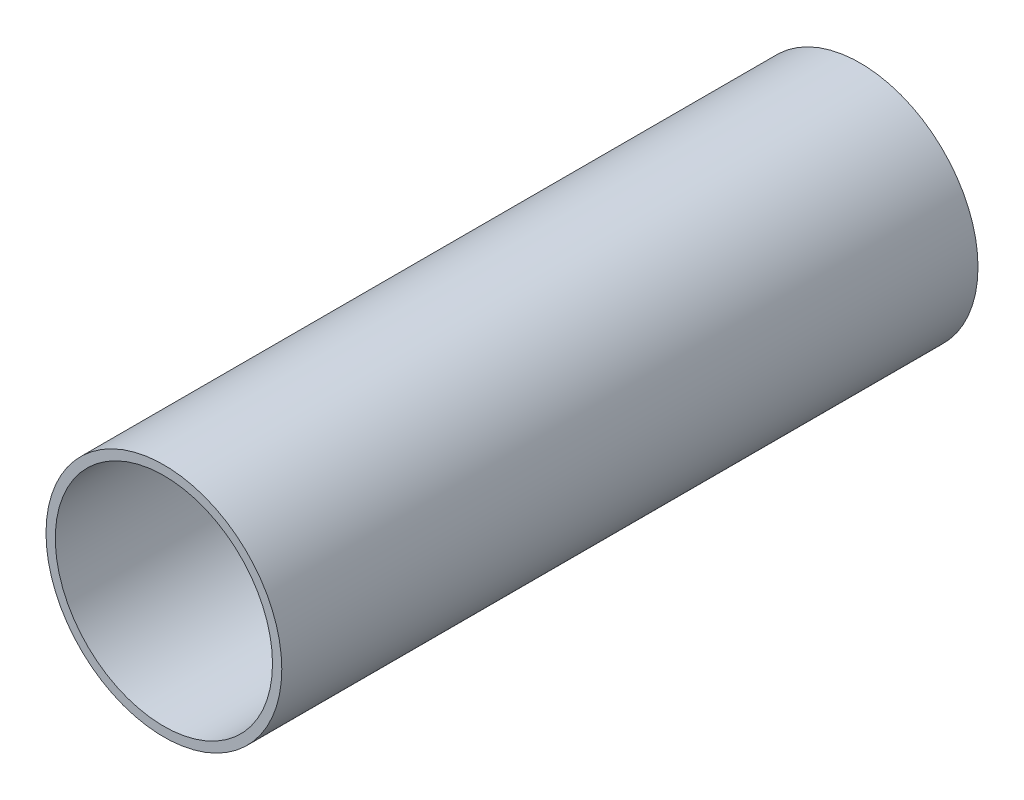
ISO-10303-21;
HEADER;
FILE_DESCRIPTION(('STEP AP214'),'2;1');
FILE_NAME('part.step','',(''),(''),'','','');
FILE_SCHEMA(('AUTOMOTIVE_DESIGN { 1 0 10303 214 1 1 1 1 }'));
ENDSEC;
DATA;
#1=APPLICATION_CONTEXT('core data for automotive mechanical design processes');
#2=APPLICATION_PROTOCOL_DEFINITION('international standard','automotive_design',2000,#1);
#3=PRODUCT_CONTEXT('',#1,'mechanical');
#4=PRODUCT('Part','Part','',(#3));
#5=PRODUCT_RELATED_PRODUCT_CATEGORY('part','',(#4));
#6=PRODUCT_DEFINITION_FORMATION('','',#4);
#7=PRODUCT_DEFINITION_CONTEXT('part definition',#1,'design');
#8=PRODUCT_DEFINITION('design','',#6,#7);
#9=PRODUCT_DEFINITION_SHAPE('','',#8);
#10=(LENGTH_UNIT() NAMED_UNIT(*) SI_UNIT(.MILLI.,.METRE.));
#11=(NAMED_UNIT(*) PLANE_ANGLE_UNIT() SI_UNIT($,.RADIAN.));
#12=(NAMED_UNIT(*) SI_UNIT($,.STERADIAN.) SOLID_ANGLE_UNIT());
#13=UNCERTAINTY_MEASURE_WITH_UNIT(LENGTH_MEASURE(1.E-05),#10,'distance_accuracy_value','');
#14=(GEOMETRIC_REPRESENTATION_CONTEXT(3) GLOBAL_UNCERTAINTY_ASSIGNED_CONTEXT((#13)) GLOBAL_UNIT_ASSIGNED_CONTEXT((#10,
#11,#12)) REPRESENTATION_CONTEXT('',''));
#15=CARTESIAN_POINT('',(0.,0.,0.));
#16=DIRECTION('',(0.,0.,1.));
#17=DIRECTION('',(1.,0.,0.));
#18=AXIS2_PLACEMENT_3D('',#15,#16,#17);
#19=CARTESIAN_POINT('',(0.,0.,150.));
#20=DIRECTION('',(0.,0.,1.));
#21=DIRECTION('',(1.,0.,0.));
#22=AXIS2_PLACEMENT_3D('',#19,#20,#21);
#23=PLANE('',#22);
#24=CARTESIAN_POINT('',(0.,0.,150.));
#25=DIRECTION('',(0.,0.,1.));
#26=DIRECTION('',(1.,0.,0.));
#27=AXIS2_PLACEMENT_3D('',#24,#25,#26);
#28=CIRCLE('',#27,25.4);
#29=CARTESIAN_POINT('',(25.4,0.,150.));
#30=VERTEX_POINT('',#29);
#31=EDGE_CURVE('E10',#30,#30,#28,.T.);
#32=ORIENTED_EDGE('',*,*,#31,.T.);
#33=EDGE_LOOP('',(#32));
#34=FACE_BOUND('',#33,.T.);
#35=CARTESIAN_POINT('',(0.,0.,150.));
#36=DIRECTION('',(0.,0.,1.));
#37=DIRECTION('',(1.,0.,0.));
#38=AXIS2_PLACEMENT_3D('',#35,#36,#37);
#39=CIRCLE('',#38,23.4);
#40=CARTESIAN_POINT('',(23.4,0.,150.));
#41=VERTEX_POINT('',#40);
#42=EDGE_CURVE('E44',#41,#41,#39,.T.);
#43=ORIENTED_EDGE('',*,*,#42,.F.);
#44=EDGE_LOOP('',(#43));
#45=FACE_BOUND('',#44,.T.);
#46=ADVANCED_FACE('F33',(#34,#45),#23,.T.);
#47=CARTESIAN_POINT('',(0.,0.,0.));
#48=DIRECTION('',(0.,0.,1.));
#49=DIRECTION('',(1.,0.,0.));
#50=AXIS2_PLACEMENT_3D('',#47,#48,#49);
#51=PLANE('',#50);
#52=CARTESIAN_POINT('',(0.,0.,0.));
#53=DIRECTION('',(0.,0.,1.));
#54=DIRECTION('',(1.,0.,0.));
#55=AXIS2_PLACEMENT_3D('',#52,#53,#54);
#56=CIRCLE('',#55,25.4);
#57=CARTESIAN_POINT('',(25.4,0.,0.));
#58=VERTEX_POINT('',#57);
#59=EDGE_CURVE('E37',#58,#58,#56,.T.);
#60=ORIENTED_EDGE('',*,*,#59,.F.);
#61=EDGE_LOOP('',(#60));
#62=FACE_BOUND('',#61,.T.);
#63=CARTESIAN_POINT('',(0.,0.,0.));
#64=DIRECTION('',(0.,0.,1.));
#65=DIRECTION('',(1.,0.,0.));
#66=AXIS2_PLACEMENT_3D('',#63,#64,#65);
#67=CIRCLE('',#66,23.4);
#68=CARTESIAN_POINT('',(23.4,0.,0.));
#69=VERTEX_POINT('',#68);
#70=EDGE_CURVE('E46',#69,#69,#67,.T.);
#71=ORIENTED_EDGE('',*,*,#70,.T.);
#72=EDGE_LOOP('',(#71));
#73=FACE_BOUND('',#72,.T.);
#74=ADVANCED_FACE('F56',(#62,#73),#51,.F.);
#75=CARTESIAN_POINT('',(0.,0.,150.));
#76=DIRECTION('',(0.,0.,-1.));
#77=DIRECTION('',(-1.,0.,0.));
#78=AXIS2_PLACEMENT_3D('',#75,#76,#77);
#79=CYLINDRICAL_SURFACE('',#78,25.4);
#80=ORIENTED_EDGE('',*,*,#31,.F.);
#81=EDGE_LOOP('',(#80));
#82=FACE_BOUND('',#81,.T.);
#83=ORIENTED_EDGE('',*,*,#59,.T.);
#84=EDGE_LOOP('',(#83));
#85=FACE_BOUND('',#84,.T.);
#86=ADVANCED_FACE('F35',(#82,#85),#79,.T.);
#87=CARTESIAN_POINT('',(0.,0.,150.));
#88=DIRECTION('',(0.,0.,-1.));
#89=DIRECTION('',(-1.,0.,0.));
#90=AXIS2_PLACEMENT_3D('',#87,#88,#89);
#91=CYLINDRICAL_SURFACE('',#90,23.4);
#92=ORIENTED_EDGE('',*,*,#42,.T.);
#93=EDGE_LOOP('',(#92));
#94=FACE_BOUND('',#93,.T.);
#95=ORIENTED_EDGE('',*,*,#70,.F.);
#96=EDGE_LOOP('',(#95));
#97=FACE_BOUND('',#96,.T.);
#98=ADVANCED_FACE('F52',(#94,#97),#91,.F.);
#99=CLOSED_SHELL('',(#46,#74,#86,#98));
#100=MANIFOLD_SOLID_BREP('B2',#99);
#101=ADVANCED_BREP_SHAPE_REPRESENTATION('',(#18,#100),#14);
#102=SHAPE_DEFINITION_REPRESENTATION(#9,#101);
ENDSEC;
END-ISO-10303-21;
